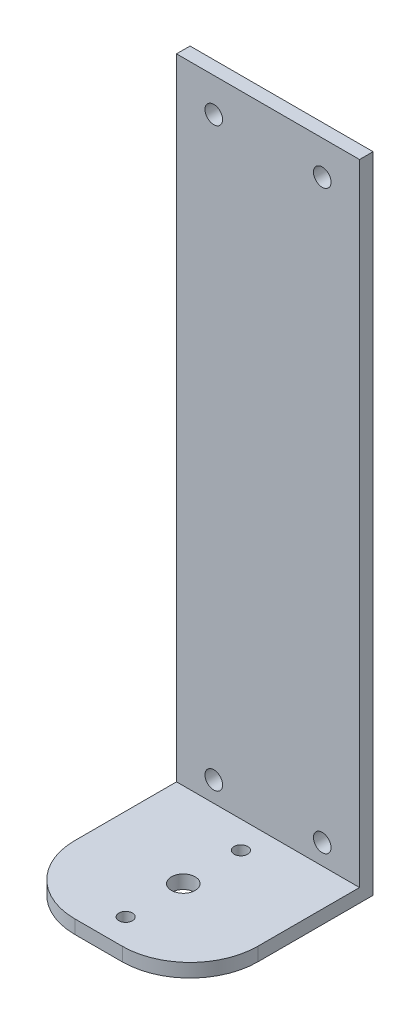
ISO-10303-21;
HEADER;
FILE_DESCRIPTION(('STEP AP214'),'2;1');
FILE_NAME('part.step','',(''),(''),'','','');
FILE_SCHEMA(('AUTOMOTIVE_DESIGN { 1 0 10303 214 1 1 1 1 }'));
ENDSEC;
DATA;
#1=APPLICATION_CONTEXT('core data for automotive mechanical design processes');
#2=APPLICATION_PROTOCOL_DEFINITION('international standard','automotive_design',2000,#1);
#3=PRODUCT_CONTEXT('',#1,'mechanical');
#4=PRODUCT('Part','Part','',(#3));
#5=PRODUCT_RELATED_PRODUCT_CATEGORY('part','',(#4));
#6=PRODUCT_DEFINITION_FORMATION('','',#4);
#7=PRODUCT_DEFINITION_CONTEXT('part definition',#1,'design');
#8=PRODUCT_DEFINITION('design','',#6,#7);
#9=PRODUCT_DEFINITION_SHAPE('','',#8);
#10=(LENGTH_UNIT() NAMED_UNIT(*) SI_UNIT(.MILLI.,.METRE.));
#11=(NAMED_UNIT(*) PLANE_ANGLE_UNIT() SI_UNIT($,.RADIAN.));
#12=(NAMED_UNIT(*) SI_UNIT($,.STERADIAN.) SOLID_ANGLE_UNIT());
#13=UNCERTAINTY_MEASURE_WITH_UNIT(LENGTH_MEASURE(1.E-05),#10,'distance_accuracy_value','');
#14=(GEOMETRIC_REPRESENTATION_CONTEXT(3) GLOBAL_UNCERTAINTY_ASSIGNED_CONTEXT((#13)) GLOBAL_UNIT_ASSIGNED_CONTEXT((#10,
#11,#12)) REPRESENTATION_CONTEXT('',''));
#15=CARTESIAN_POINT('',(0.,0.,0.));
#16=DIRECTION('',(0.,0.,1.));
#17=DIRECTION('',(1.,0.,0.));
#18=AXIS2_PLACEMENT_3D('',#15,#16,#17);
#19=CARTESIAN_POINT('',(22.8470394736842,-11.2105263157895,27.));
#20=DIRECTION('',(-1.,0.,0.));
#21=DIRECTION('',(0.,0.,1.));
#22=AXIS2_PLACEMENT_3D('',#19,#20,#21);
#23=PLANE('',#22);
#24=DIRECTION('',(0.,0.,-1.));
#25=VECTOR('',#24,1.);
#26=CARTESIAN_POINT('',(22.8470394736842,-9.21052631578947,27.));
#27=LINE('',#26,#25);
#28=CARTESIAN_POINT('',(22.8470394736842,-9.21052631578947,17.));
#29=VERTEX_POINT('',#28);
#30=CARTESIAN_POINT('',(22.8470394736842,-9.21052631578946,2.));
#31=VERTEX_POINT('',#30);
#32=EDGE_CURVE('E176',#29,#31,#27,.T.);
#33=ORIENTED_EDGE('',*,*,#32,.F.);
#34=DIRECTION('',(0.,1.,0.));
#35=VECTOR('',#34,1.);
#36=CARTESIAN_POINT('',(22.8470394736842,-11.2105263157895,17.));
#37=LINE('',#36,#35);
#38=CARTESIAN_POINT('',(22.8470394736842,-11.2105263157895,17.));
#39=VERTEX_POINT('',#38);
#40=EDGE_CURVE('E11',#29,#39,#37,.F.);
#41=ORIENTED_EDGE('',*,*,#40,.T.);
#42=DIRECTION('',(0.,0.,-1.));
#43=VECTOR('',#42,1.);
#44=CARTESIAN_POINT('',(22.8470394736842,-11.2105263157895,27.));
#45=LINE('',#44,#43);
#46=CARTESIAN_POINT('',(22.8470394736842,-11.2105263157895,0.));
#47=VERTEX_POINT('',#46);
#48=EDGE_CURVE('E116',#39,#47,#45,.T.);
#49=ORIENTED_EDGE('',*,*,#48,.T.);
#50=DIRECTION('',(0.,1.,0.));
#51=VECTOR('',#50,1.);
#52=CARTESIAN_POINT('',(22.8470394736842,-11.2105263157895,0.));
#53=LINE('',#52,#51);
#54=CARTESIAN_POINT('',(22.8470394736842,83.7894736842105,0.));
#55=VERTEX_POINT('',#54);
#56=EDGE_CURVE('E112',#47,#55,#53,.T.);
#57=ORIENTED_EDGE('',*,*,#56,.T.);
#58=DIRECTION('',(0.,0.,1.));
#59=VECTOR('',#58,1.);
#60=CARTESIAN_POINT('',(22.8470394736842,83.7894736842105,0.));
#61=LINE('',#60,#59);
#62=CARTESIAN_POINT('',(22.8470394736842,83.7894736842105,2.));
#63=VERTEX_POINT('',#62);
#64=EDGE_CURVE('E111',#55,#63,#61,.T.);
#65=ORIENTED_EDGE('',*,*,#64,.T.);
#66=DIRECTION('',(0.,1.,0.));
#67=VECTOR('',#66,1.);
#68=CARTESIAN_POINT('',(22.8470394736842,15.7894736842105,2.));
#69=LINE('',#68,#67);
#70=EDGE_CURVE('E181',#31,#63,#69,.T.);
#71=ORIENTED_EDGE('',*,*,#70,.F.);
#72=EDGE_LOOP('',(#33,#41,#49,#57,#65,#71));
#73=FACE_BOUND('',#72,.T.);
#74=ADVANCED_FACE('F42',(#73),#23,.F.);
#75=CARTESIAN_POINT('',(-4.15296052631579,-11.2105263157895,27.));
#76=DIRECTION('',(1.,0.,0.));
#77=DIRECTION('',(0.,0.,-1.));
#78=AXIS2_PLACEMENT_3D('',#75,#76,#77);
#79=PLANE('',#78);
#80=DIRECTION('',(0.,0.,-1.));
#81=VECTOR('',#80,1.);
#82=CARTESIAN_POINT('',(-4.15296052631579,-11.2105263157895,27.));
#83=LINE('',#82,#81);
#84=CARTESIAN_POINT('',(-4.15296052631579,-11.2105263157895,17.));
#85=VERTEX_POINT('',#84);
#86=CARTESIAN_POINT('',(-4.15296052631579,-11.2105263157895,0.));
#87=VERTEX_POINT('',#86);
#88=EDGE_CURVE('E197',#85,#87,#83,.T.);
#89=ORIENTED_EDGE('',*,*,#88,.F.);
#90=DIRECTION('',(0.,-1.,0.));
#91=VECTOR('',#90,1.);
#92=CARTESIAN_POINT('',(-4.15296052631579,-9.21052631578947,17.));
#93=LINE('',#92,#91);
#94=CARTESIAN_POINT('',(-4.15296052631579,-9.21052631578947,17.));
#95=VERTEX_POINT('',#94);
#96=EDGE_CURVE('E68',#85,#95,#93,.F.);
#97=ORIENTED_EDGE('',*,*,#96,.T.);
#98=DIRECTION('',(0.,0.,1.));
#99=VECTOR('',#98,1.);
#100=CARTESIAN_POINT('',(-4.15296052631579,-9.21052631578947,27.));
#101=LINE('',#100,#99);
#102=CARTESIAN_POINT('',(-4.15296052631579,-9.21052631578946,2.));
#103=VERTEX_POINT('',#102);
#104=EDGE_CURVE('E175',#103,#95,#101,.T.);
#105=ORIENTED_EDGE('',*,*,#104,.F.);
#106=DIRECTION('',(0.,-1.,0.));
#107=VECTOR('',#106,1.);
#108=CARTESIAN_POINT('',(-4.15296052631579,15.7894736842105,2.));
#109=LINE('',#108,#107);
#110=CARTESIAN_POINT('',(-4.15296052631579,83.7894736842105,2.));
#111=VERTEX_POINT('',#110);
#112=EDGE_CURVE('E177',#111,#103,#109,.T.);
#113=ORIENTED_EDGE('',*,*,#112,.F.);
#114=DIRECTION('',(0.,0.,1.));
#115=VECTOR('',#114,1.);
#116=CARTESIAN_POINT('',(-4.15296052631579,83.7894736842105,0.));
#117=LINE('',#116,#115);
#118=CARTESIAN_POINT('',(-4.15296052631579,83.7894736842105,0.));
#119=VERTEX_POINT('',#118);
#120=EDGE_CURVE('E133',#119,#111,#117,.T.);
#121=ORIENTED_EDGE('',*,*,#120,.F.);
#122=DIRECTION('',(0.,-1.,0.));
#123=VECTOR('',#122,1.);
#124=CARTESIAN_POINT('',(-4.15296052631579,-11.2105263157895,0.));
#125=LINE('',#124,#123);
#126=EDGE_CURVE('E123',#119,#87,#125,.T.);
#127=ORIENTED_EDGE('',*,*,#126,.T.);
#128=EDGE_LOOP('',(#89,#97,#105,#113,#121,#127));
#129=FACE_BOUND('',#128,.T.);
#130=ADVANCED_FACE('F237',(#129),#79,.F.);
#131=CARTESIAN_POINT('',(-4.15296052631579,-11.2105263157895,27.));
#132=DIRECTION('',(0.,1.,0.));
#133=DIRECTION('',(-1.,0.,0.));
#134=AXIS2_PLACEMENT_3D('',#131,#132,#133);
#135=PLANE('',#134);
#136=CARTESIAN_POINT('',(9.34703947368421,-11.2105263157895,6.));
#137=DIRECTION('',(0.,1.,0.));
#138=DIRECTION('',(-1.,0.,0.));
#139=AXIS2_PLACEMENT_3D('',#136,#137,#138);
#140=CIRCLE('',#139,1.);
#141=CARTESIAN_POINT('',(8.34703947368421,-11.2105263157895,6.));
#142=VERTEX_POINT('',#141);
#143=EDGE_CURVE('E146',#142,#142,#140,.F.);
#144=ORIENTED_EDGE('',*,*,#143,.F.);
#145=EDGE_LOOP('',(#144));
#146=FACE_BOUND('',#145,.T.);
#147=CARTESIAN_POINT('',(9.34703947368421,-11.2105263157895,23.));
#148=DIRECTION('',(0.,1.,0.));
#149=DIRECTION('',(-1.,0.,0.));
#150=AXIS2_PLACEMENT_3D('',#147,#148,#149);
#151=CIRCLE('',#150,1.);
#152=CARTESIAN_POINT('',(8.34703947368421,-11.2105263157895,23.));
#153=VERTEX_POINT('',#152);
#154=EDGE_CURVE('E147',#153,#153,#151,.F.);
#155=ORIENTED_EDGE('',*,*,#154,.F.);
#156=EDGE_LOOP('',(#155));
#157=FACE_BOUND('',#156,.T.);
#158=CARTESIAN_POINT('',(9.34703947368421,-11.2105263157895,14.5));
#159=DIRECTION('',(0.,1.,0.));
#160=DIRECTION('',(-1.,0.,0.));
#161=AXIS2_PLACEMENT_3D('',#158,#159,#160);
#162=CIRCLE('',#161,1.75);
#163=CARTESIAN_POINT('',(7.59703947368421,-11.2105263157895,14.5));
#164=VERTEX_POINT('',#163);
#165=EDGE_CURVE('E166',#164,#164,#162,.F.);
#166=ORIENTED_EDGE('',*,*,#165,.F.);
#167=EDGE_LOOP('',(#166));
#168=FACE_BOUND('',#167,.T.);
#169=DIRECTION('',(1.,0.,0.));
#170=VECTOR('',#169,1.);
#171=CARTESIAN_POINT('',(-4.15296052631579,-11.2105263157895,27.));
#172=LINE('',#171,#170);
#173=CARTESIAN_POINT('',(5.84703947368421,-11.2105263157895,27.));
#174=VERTEX_POINT('',#173);
#175=CARTESIAN_POINT('',(12.8470394736842,-11.2105263157895,27.));
#176=VERTEX_POINT('',#175);
#177=EDGE_CURVE('E193',#174,#176,#172,.T.);
#178=ORIENTED_EDGE('',*,*,#177,.F.);
#179=CARTESIAN_POINT('',(5.84703947368421,-11.2105263157895,17.));
#180=DIRECTION('',(0.,1.,0.));
#181=DIRECTION('',(-1.,0.,0.));
#182=AXIS2_PLACEMENT_3D('',#179,#180,#181);
#183=CIRCLE('',#182,10.);
#184=EDGE_CURVE('E220',#174,#85,#183,.F.);
#185=ORIENTED_EDGE('',*,*,#184,.T.);
#186=ORIENTED_EDGE('',*,*,#88,.T.);
#187=DIRECTION('',(1.,0.,0.));
#188=VECTOR('',#187,1.);
#189=CARTESIAN_POINT('',(-4.15296052631579,-11.2105263157895,0.));
#190=LINE('',#189,#188);
#191=EDGE_CURVE('E124',#87,#47,#190,.T.);
#192=ORIENTED_EDGE('',*,*,#191,.T.);
#193=ORIENTED_EDGE('',*,*,#48,.F.);
#194=CARTESIAN_POINT('',(12.8470394736842,-11.2105263157895,17.));
#195=DIRECTION('',(0.,1.,0.));
#196=DIRECTION('',(-1.,0.,0.));
#197=AXIS2_PLACEMENT_3D('',#194,#195,#196);
#198=CIRCLE('',#197,10.);
#199=EDGE_CURVE('E212',#39,#176,#198,.F.);
#200=ORIENTED_EDGE('',*,*,#199,.T.);
#201=EDGE_LOOP('',(#178,#185,#186,#192,#193,#200));
#202=FACE_BOUND('',#201,.T.);
#203=ADVANCED_FACE('F231',(#146,#157,#168,#202),#135,.F.);
#204=CARTESIAN_POINT('',(0.,0.,27.));
#205=DIRECTION('',(0.,0.,1.));
#206=DIRECTION('',(1.,0.,0.));
#207=AXIS2_PLACEMENT_3D('',#204,#205,#206);
#208=PLANE('',#207);
#209=DIRECTION('',(1.,0.,0.));
#210=VECTOR('',#209,1.);
#211=CARTESIAN_POINT('',(-4.15396052631579,-9.21052631578947,27.));
#212=LINE('',#211,#210);
#213=CARTESIAN_POINT('',(5.84703947368421,-9.21052631578947,27.));
#214=VERTEX_POINT('',#213);
#215=CARTESIAN_POINT('',(12.8470394736842,-9.21052631578947,27.));
#216=VERTEX_POINT('',#215);
#217=EDGE_CURVE('E189',#214,#216,#212,.T.);
#218=ORIENTED_EDGE('',*,*,#217,.F.);
#219=DIRECTION('',(0.,-1.,0.));
#220=VECTOR('',#219,1.);
#221=CARTESIAN_POINT('',(5.84703947368421,-11.2105263157895,27.));
#222=LINE('',#221,#220);
#223=EDGE_CURVE('E209',#214,#174,#222,.T.);
#224=ORIENTED_EDGE('',*,*,#223,.T.);
#225=ORIENTED_EDGE('',*,*,#177,.T.);
#226=DIRECTION('',(0.,1.,0.));
#227=VECTOR('',#226,1.);
#228=CARTESIAN_POINT('',(12.8470394736842,-9.21052631578947,27.));
#229=LINE('',#228,#227);
#230=EDGE_CURVE('E206',#176,#216,#229,.T.);
#231=ORIENTED_EDGE('',*,*,#230,.T.);
#232=EDGE_LOOP('',(#218,#224,#225,#231));
#233=FACE_BOUND('',#232,.T.);
#234=ADVANCED_FACE('F227',(#233),#208,.T.);
#235=CARTESIAN_POINT('',(0.,0.,0.));
#236=DIRECTION('',(0.,0.,1.));
#237=DIRECTION('',(1.,0.,0.));
#238=AXIS2_PLACEMENT_3D('',#235,#236,#237);
#239=PLANE('',#238);
#240=CARTESIAN_POINT('',(1.34703947368421,78.7894736842105,0.));
#241=DIRECTION('',(0.,0.,1.));
#242=DIRECTION('',(1.,0.,0.));
#243=AXIS2_PLACEMENT_3D('',#240,#241,#242);
#244=CIRCLE('',#243,1.3);
#245=CARTESIAN_POINT('',(2.64703947368421,78.7894736842105,0.));
#246=VERTEX_POINT('',#245);
#247=EDGE_CURVE('E427',#246,#246,#244,.F.);
#248=ORIENTED_EDGE('',*,*,#247,.F.);
#249=EDGE_LOOP('',(#248));
#250=FACE_BOUND('',#249,.T.);
#251=CARTESIAN_POINT('',(17.3470394736842,-6.21052631578947,0.));
#252=DIRECTION('',(0.,0.,1.));
#253=DIRECTION('',(1.,0.,0.));
#254=AXIS2_PLACEMENT_3D('',#251,#252,#253);
#255=CIRCLE('',#254,1.3);
#256=CARTESIAN_POINT('',(18.6470394736842,-6.21052631578947,0.));
#257=VERTEX_POINT('',#256);
#258=EDGE_CURVE('E426',#257,#257,#255,.F.);
#259=ORIENTED_EDGE('',*,*,#258,.F.);
#260=EDGE_LOOP('',(#259));
#261=FACE_BOUND('',#260,.T.);
#262=CARTESIAN_POINT('',(17.3470394736842,78.7894736842105,0.));
#263=DIRECTION('',(0.,0.,1.));
#264=DIRECTION('',(1.,0.,0.));
#265=AXIS2_PLACEMENT_3D('',#262,#263,#264);
#266=CIRCLE('',#265,1.3);
#267=CARTESIAN_POINT('',(18.6470394736842,78.7894736842105,0.));
#268=VERTEX_POINT('',#267);
#269=EDGE_CURVE('E423',#268,#268,#266,.F.);
#270=ORIENTED_EDGE('',*,*,#269,.F.);
#271=EDGE_LOOP('',(#270));
#272=FACE_BOUND('',#271,.T.);
#273=CARTESIAN_POINT('',(1.34703947368421,-6.21052631578947,0.));
#274=DIRECTION('',(0.,0.,1.));
#275=DIRECTION('',(1.,0.,0.));
#276=AXIS2_PLACEMENT_3D('',#273,#274,#275);
#277=CIRCLE('',#276,1.3);
#278=CARTESIAN_POINT('',(2.64703947368421,-6.21052631578947,0.));
#279=VERTEX_POINT('',#278);
#280=EDGE_CURVE('E142',#279,#279,#277,.F.);
#281=ORIENTED_EDGE('',*,*,#280,.F.);
#282=EDGE_LOOP('',(#281));
#283=FACE_BOUND('',#282,.T.);
#284=ORIENTED_EDGE('',*,*,#191,.F.);
#285=ORIENTED_EDGE('',*,*,#126,.F.);
#286=DIRECTION('',(-1.,0.,0.));
#287=VECTOR('',#286,1.);
#288=CARTESIAN_POINT('',(-4.15296052631579,83.7894736842105,0.));
#289=LINE('',#288,#287);
#290=EDGE_CURVE('E128',#55,#119,#289,.T.);
#291=ORIENTED_EDGE('',*,*,#290,.F.);
#292=ORIENTED_EDGE('',*,*,#56,.F.);
#293=EDGE_LOOP('',(#284,#285,#291,#292));
#294=FACE_BOUND('',#293,.T.);
#295=ADVANCED_FACE('F137',(#250,#261,#272,#283,#294),#239,.F.);
#296=CARTESIAN_POINT('',(-4.15396052631579,15.7894736842105,2.));
#297=DIRECTION('',(0.,0.,-1.));
#298=DIRECTION('',(0.,1.,0.));
#299=AXIS2_PLACEMENT_3D('',#296,#297,#298);
#300=PLANE('',#299);
#301=CARTESIAN_POINT('',(1.34703947368421,78.7894736842105,2.));
#302=DIRECTION('',(0.,0.,1.));
#303=DIRECTION('',(1.,0.,0.));
#304=AXIS2_PLACEMENT_3D('',#301,#302,#303);
#305=CIRCLE('',#304,1.3);
#306=CARTESIAN_POINT('',(2.64703947368421,78.7894736842105,2.));
#307=VERTEX_POINT('',#306);
#308=EDGE_CURVE('E433',#307,#307,#305,.T.);
#309=ORIENTED_EDGE('',*,*,#308,.F.);
#310=EDGE_LOOP('',(#309));
#311=FACE_BOUND('',#310,.T.);
#312=CARTESIAN_POINT('',(17.3470394736842,-6.21052631578947,2.));
#313=DIRECTION('',(0.,0.,1.));
#314=DIRECTION('',(-1.,0.,0.));
#315=AXIS2_PLACEMENT_3D('',#312,#313,#314);
#316=CIRCLE('',#315,1.3);
#317=CARTESIAN_POINT('',(16.0470394736842,-6.21052631578947,2.));
#318=VERTEX_POINT('',#317);
#319=EDGE_CURVE('E432',#318,#318,#316,.T.);
#320=ORIENTED_EDGE('',*,*,#319,.F.);
#321=EDGE_LOOP('',(#320));
#322=FACE_BOUND('',#321,.T.);
#323=CARTESIAN_POINT('',(17.3470394736842,78.7894736842105,2.));
#324=DIRECTION('',(0.,0.,1.));
#325=DIRECTION('',(-1.,0.,0.));
#326=AXIS2_PLACEMENT_3D('',#323,#324,#325);
#327=CIRCLE('',#326,1.3);
#328=CARTESIAN_POINT('',(16.0470394736842,78.7894736842105,2.));
#329=VERTEX_POINT('',#328);
#330=EDGE_CURVE('E416',#329,#329,#327,.T.);
#331=ORIENTED_EDGE('',*,*,#330,.F.);
#332=EDGE_LOOP('',(#331));
#333=FACE_BOUND('',#332,.T.);
#334=CARTESIAN_POINT('',(1.34703947368421,-6.21052631578947,2.));
#335=DIRECTION('',(0.,0.,1.));
#336=DIRECTION('',(1.,0.,0.));
#337=AXIS2_PLACEMENT_3D('',#334,#335,#336);
#338=CIRCLE('',#337,1.3);
#339=CARTESIAN_POINT('',(2.64703947368421,-6.21052631578947,2.));
#340=VERTEX_POINT('',#339);
#341=EDGE_CURVE('E440',#340,#340,#338,.T.);
#342=ORIENTED_EDGE('',*,*,#341,.F.);
#343=EDGE_LOOP('',(#342));
#344=FACE_BOUND('',#343,.T.);
#345=ORIENTED_EDGE('',*,*,#112,.T.);
#346=DIRECTION('',(1.,0.,0.));
#347=VECTOR('',#346,1.);
#348=CARTESIAN_POINT('',(-4.15396052631579,-9.21052631578946,2.));
#349=LINE('',#348,#347);
#350=EDGE_CURVE('E186',#103,#31,#349,.T.);
#351=ORIENTED_EDGE('',*,*,#350,.T.);
#352=ORIENTED_EDGE('',*,*,#70,.T.);
#353=DIRECTION('',(-1.,0.,0.));
#354=VECTOR('',#353,1.);
#355=CARTESIAN_POINT('',(-4.15296052631579,83.7894736842105,2.));
#356=LINE('',#355,#354);
#357=EDGE_CURVE('E131',#63,#111,#356,.T.);
#358=ORIENTED_EDGE('',*,*,#357,.T.);
#359=EDGE_LOOP('',(#345,#351,#352,#358));
#360=FACE_BOUND('',#359,.T.);
#361=ADVANCED_FACE('F244',(#311,#322,#333,#344,#360),#300,.F.);
#362=CARTESIAN_POINT('',(-4.15396052631579,-9.21052631578947,27.));
#363=DIRECTION('',(0.,-1.,0.));
#364=DIRECTION('',(0.,0.,-1.));
#365=AXIS2_PLACEMENT_3D('',#362,#363,#364);
#366=PLANE('',#365);
#367=CARTESIAN_POINT('',(9.34703947368421,-9.21052631578946,6.));
#368=DIRECTION('',(0.,1.,0.));
#369=DIRECTION('',(0.,0.,-1.));
#370=AXIS2_PLACEMENT_3D('',#367,#368,#369);
#371=CIRCLE('',#370,1.);
#372=CARTESIAN_POINT('',(9.34703947368421,-9.21052631578946,5.));
#373=VERTEX_POINT('',#372);
#374=EDGE_CURVE('E154',#373,#373,#371,.T.);
#375=ORIENTED_EDGE('',*,*,#374,.F.);
#376=EDGE_LOOP('',(#375));
#377=FACE_BOUND('',#376,.T.);
#378=CARTESIAN_POINT('',(9.34703947368421,-9.21052631578947,23.));
#379=DIRECTION('',(0.,1.,0.));
#380=DIRECTION('',(0.,0.,1.));
#381=AXIS2_PLACEMENT_3D('',#378,#379,#380);
#382=CIRCLE('',#381,1.);
#383=CARTESIAN_POINT('',(9.34703947368421,-9.21052631578947,24.));
#384=VERTEX_POINT('',#383);
#385=EDGE_CURVE('E152',#384,#384,#382,.T.);
#386=ORIENTED_EDGE('',*,*,#385,.F.);
#387=EDGE_LOOP('',(#386));
#388=FACE_BOUND('',#387,.T.);
#389=CARTESIAN_POINT('',(9.34703947368421,-9.21052631578947,14.5));
#390=DIRECTION('',(0.,1.,0.));
#391=DIRECTION('',(0.,0.,1.));
#392=AXIS2_PLACEMENT_3D('',#389,#390,#391);
#393=CIRCLE('',#392,1.75);
#394=CARTESIAN_POINT('',(9.34703947368421,-9.21052631578947,16.25));
#395=VERTEX_POINT('',#394);
#396=EDGE_CURVE('E157',#395,#395,#393,.T.);
#397=ORIENTED_EDGE('',*,*,#396,.F.);
#398=EDGE_LOOP('',(#397));
#399=FACE_BOUND('',#398,.T.);
#400=ORIENTED_EDGE('',*,*,#104,.T.);
#401=CARTESIAN_POINT('',(5.84703947368421,-9.21052631578947,17.));
#402=DIRECTION('',(0.,-1.,0.));
#403=DIRECTION('',(0.,0.,-1.));
#404=AXIS2_PLACEMENT_3D('',#401,#402,#403);
#405=CIRCLE('',#404,10.);
#406=EDGE_CURVE('E52',#95,#214,#405,.F.);
#407=ORIENTED_EDGE('',*,*,#406,.T.);
#408=ORIENTED_EDGE('',*,*,#217,.T.);
#409=CARTESIAN_POINT('',(12.8470394736842,-9.21052631578947,17.));
#410=DIRECTION('',(0.,-1.,0.));
#411=DIRECTION('',(0.,0.,-1.));
#412=AXIS2_PLACEMENT_3D('',#409,#410,#411);
#413=CIRCLE('',#412,10.);
#414=EDGE_CURVE('E58',#216,#29,#413,.F.);
#415=ORIENTED_EDGE('',*,*,#414,.T.);
#416=ORIENTED_EDGE('',*,*,#32,.T.);
#417=ORIENTED_EDGE('',*,*,#350,.F.);
#418=EDGE_LOOP('',(#400,#407,#408,#415,#416,#417));
#419=FACE_BOUND('',#418,.T.);
#420=ADVANCED_FACE('F229',(#377,#388,#399,#419),#366,.F.);
#421=CARTESIAN_POINT('',(9.34703947368421,-11.2115263157895,14.5));
#422=DIRECTION('',(0.,1.,0.));
#423=DIRECTION('',(0.,0.,1.));
#424=AXIS2_PLACEMENT_3D('',#421,#422,#423);
#425=CYLINDRICAL_SURFACE('',#424,1.75);
#426=ORIENTED_EDGE('',*,*,#396,.T.);
#427=EDGE_LOOP('',(#426));
#428=FACE_BOUND('',#427,.T.);
#429=ORIENTED_EDGE('',*,*,#165,.T.);
#430=EDGE_LOOP('',(#429));
#431=FACE_BOUND('',#430,.T.);
#432=ADVANCED_FACE('F246',(#428,#431),#425,.F.);
#433=CARTESIAN_POINT('',(9.34703947368421,-11.2115263157895,23.));
#434=DIRECTION('',(0.,1.,0.));
#435=DIRECTION('',(0.,0.,1.));
#436=AXIS2_PLACEMENT_3D('',#433,#434,#435);
#437=CYLINDRICAL_SURFACE('',#436,1.);
#438=ORIENTED_EDGE('',*,*,#385,.T.);
#439=EDGE_LOOP('',(#438));
#440=FACE_BOUND('',#439,.T.);
#441=ORIENTED_EDGE('',*,*,#154,.T.);
#442=EDGE_LOOP('',(#441));
#443=FACE_BOUND('',#442,.T.);
#444=ADVANCED_FACE('F295',(#440,#443),#437,.F.);
#445=CARTESIAN_POINT('',(9.34703947368421,-11.2115263157895,6.));
#446=DIRECTION('',(0.,1.,0.));
#447=DIRECTION('',(0.,0.,1.));
#448=AXIS2_PLACEMENT_3D('',#445,#446,#447);
#449=CYLINDRICAL_SURFACE('',#448,1.);
#450=ORIENTED_EDGE('',*,*,#374,.T.);
#451=EDGE_LOOP('',(#450));
#452=FACE_BOUND('',#451,.T.);
#453=ORIENTED_EDGE('',*,*,#143,.T.);
#454=EDGE_LOOP('',(#453));
#455=FACE_BOUND('',#454,.T.);
#456=ADVANCED_FACE('F292',(#452,#455),#449,.F.);
#457=CARTESIAN_POINT('',(-4.15296052631579,83.7894736842105,0.));
#458=DIRECTION('',(0.,1.,0.));
#459=DIRECTION('',(0.,0.,1.));
#460=AXIS2_PLACEMENT_3D('',#457,#458,#459);
#461=PLANE('',#460);
#462=ORIENTED_EDGE('',*,*,#357,.F.);
#463=ORIENTED_EDGE('',*,*,#64,.F.);
#464=ORIENTED_EDGE('',*,*,#290,.T.);
#465=ORIENTED_EDGE('',*,*,#120,.T.);
#466=EDGE_LOOP('',(#462,#463,#464,#465));
#467=FACE_BOUND('',#466,.T.);
#468=ADVANCED_FACE('F126',(#467),#461,.T.);
#469=CARTESIAN_POINT('',(1.34703947368421,-6.21052631578947,-0.0010000000000036));
#470=DIRECTION('',(0.,0.,1.));
#471=DIRECTION('',(1.,0.,0.));
#472=AXIS2_PLACEMENT_3D('',#469,#470,#471);
#473=CYLINDRICAL_SURFACE('',#472,1.3);
#474=ORIENTED_EDGE('',*,*,#341,.T.);
#475=EDGE_LOOP('',(#474));
#476=FACE_BOUND('',#475,.T.);
#477=ORIENTED_EDGE('',*,*,#280,.T.);
#478=EDGE_LOOP('',(#477));
#479=FACE_BOUND('',#478,.T.);
#480=ADVANCED_FACE('F287',(#476,#479),#473,.F.);
#481=CARTESIAN_POINT('',(17.3470394736842,78.7894736842105,-0.0010000000000036));
#482=DIRECTION('',(0.,0.,1.));
#483=DIRECTION('',(1.,0.,0.));
#484=AXIS2_PLACEMENT_3D('',#481,#482,#483);
#485=CYLINDRICAL_SURFACE('',#484,1.3);
#486=ORIENTED_EDGE('',*,*,#330,.T.);
#487=EDGE_LOOP('',(#486));
#488=FACE_BOUND('',#487,.T.);
#489=ORIENTED_EDGE('',*,*,#269,.T.);
#490=EDGE_LOOP('',(#489));
#491=FACE_BOUND('',#490,.T.);
#492=ADVANCED_FACE('F276',(#488,#491),#485,.F.);
#493=CARTESIAN_POINT('',(17.3470394736842,-6.21052631578947,-0.0010000000000036));
#494=DIRECTION('',(0.,0.,1.));
#495=DIRECTION('',(1.,0.,0.));
#496=AXIS2_PLACEMENT_3D('',#493,#494,#495);
#497=CYLINDRICAL_SURFACE('',#496,1.3);
#498=ORIENTED_EDGE('',*,*,#319,.T.);
#499=EDGE_LOOP('',(#498));
#500=FACE_BOUND('',#499,.T.);
#501=ORIENTED_EDGE('',*,*,#258,.T.);
#502=EDGE_LOOP('',(#501));
#503=FACE_BOUND('',#502,.T.);
#504=ADVANCED_FACE('F272',(#500,#503),#497,.F.);
#505=CARTESIAN_POINT('',(1.34703947368421,78.7894736842105,-0.0010000000000036));
#506=DIRECTION('',(0.,0.,1.));
#507=DIRECTION('',(1.,0.,0.));
#508=AXIS2_PLACEMENT_3D('',#505,#506,#507);
#509=CYLINDRICAL_SURFACE('',#508,1.3);
#510=ORIENTED_EDGE('',*,*,#308,.T.);
#511=EDGE_LOOP('',(#510));
#512=FACE_BOUND('',#511,.T.);
#513=ORIENTED_EDGE('',*,*,#247,.T.);
#514=EDGE_LOOP('',(#513));
#515=FACE_BOUND('',#514,.T.);
#516=ADVANCED_FACE('F267',(#512,#515),#509,.F.);
#517=CARTESIAN_POINT('',(5.84703947368421,0.,17.));
#518=DIRECTION('',(0.,1.,0.));
#519=DIRECTION('',(0.,0.,1.));
#520=AXIS2_PLACEMENT_3D('',#517,#518,#519);
#521=CYLINDRICAL_SURFACE('',#520,10.);
#522=ORIENTED_EDGE('',*,*,#406,.F.);
#523=ORIENTED_EDGE('',*,*,#96,.F.);
#524=ORIENTED_EDGE('',*,*,#184,.F.);
#525=ORIENTED_EDGE('',*,*,#223,.F.);
#526=EDGE_LOOP('',(#522,#523,#524,#525));
#527=FACE_BOUND('',#526,.T.);
#528=ADVANCED_FACE('F233',(#527),#521,.T.);
#529=CARTESIAN_POINT('',(12.8470394736842,0.,17.));
#530=DIRECTION('',(0.,-1.,0.));
#531=DIRECTION('',(0.,0.,-1.));
#532=AXIS2_PLACEMENT_3D('',#529,#530,#531);
#533=CYLINDRICAL_SURFACE('',#532,10.);
#534=ORIENTED_EDGE('',*,*,#199,.F.);
#535=ORIENTED_EDGE('',*,*,#40,.F.);
#536=ORIENTED_EDGE('',*,*,#414,.F.);
#537=ORIENTED_EDGE('',*,*,#230,.F.);
#538=EDGE_LOOP('',(#534,#535,#536,#537));
#539=FACE_BOUND('',#538,.T.);
#540=ADVANCED_FACE('F46',(#539),#533,.T.);
#541=CLOSED_SHELL('',(#74,#130,#203,#234,#295,#361,#420,#432,#444,#456,#468,#480,#492,#504,#516,
#528,#540));
#542=MANIFOLD_SOLID_BREP('B2',#541);
#543=ADVANCED_BREP_SHAPE_REPRESENTATION('',(#18,#542),#14);
#544=SHAPE_DEFINITION_REPRESENTATION(#9,#543);
ENDSEC;
END-ISO-10303-21;
